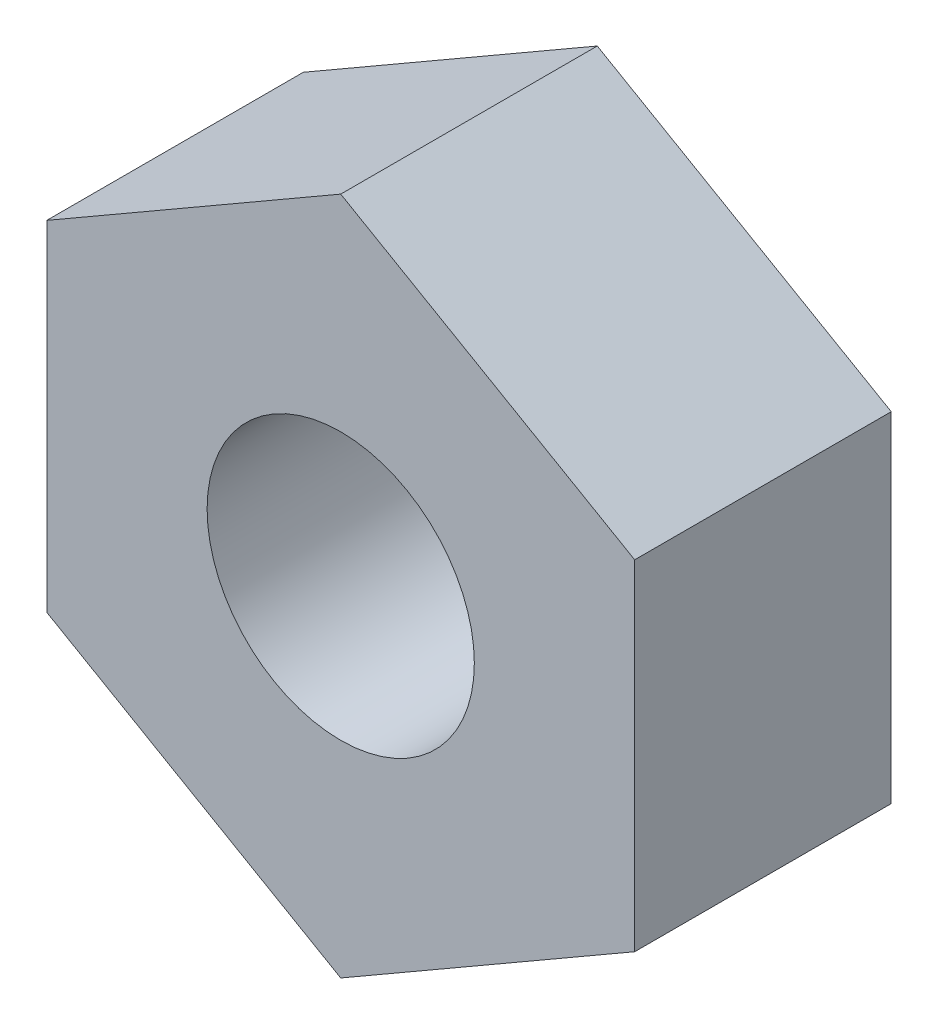
ISO-10303-21;
HEADER;
FILE_DESCRIPTION(('STEP AP214'),'2;1');
FILE_NAME('part.step','',(''),(''),'','','');
FILE_SCHEMA(('AUTOMOTIVE_DESIGN { 1 0 10303 214 1 1 1 1 }'));
ENDSEC;
DATA;
#1=APPLICATION_CONTEXT('core data for automotive mechanical design processes');
#2=APPLICATION_PROTOCOL_DEFINITION('international standard','automotive_design',2000,#1);
#3=PRODUCT_CONTEXT('',#1,'mechanical');
#4=PRODUCT('Part','Part','',(#3));
#5=PRODUCT_RELATED_PRODUCT_CATEGORY('part','',(#4));
#6=PRODUCT_DEFINITION_FORMATION('','',#4);
#7=PRODUCT_DEFINITION_CONTEXT('part definition',#1,'design');
#8=PRODUCT_DEFINITION('design','',#6,#7);
#9=PRODUCT_DEFINITION_SHAPE('','',#8);
#10=(LENGTH_UNIT() NAMED_UNIT(*) SI_UNIT(.MILLI.,.METRE.));
#11=(NAMED_UNIT(*) PLANE_ANGLE_UNIT() SI_UNIT($,.RADIAN.));
#12=(NAMED_UNIT(*) SI_UNIT($,.STERADIAN.) SOLID_ANGLE_UNIT());
#13=UNCERTAINTY_MEASURE_WITH_UNIT(LENGTH_MEASURE(1.E-05),#10,'distance_accuracy_value','');
#14=(GEOMETRIC_REPRESENTATION_CONTEXT(3) GLOBAL_UNCERTAINTY_ASSIGNED_CONTEXT((#13)) GLOBAL_UNIT_ASSIGNED_CONTEXT((#10,
#11,#12)) REPRESENTATION_CONTEXT('',''));
#15=CARTESIAN_POINT('',(0.,0.,0.));
#16=DIRECTION('',(0.,0.,1.));
#17=DIRECTION('',(1.,0.,0.));
#18=AXIS2_PLACEMENT_3D('',#15,#16,#17);
#19=CARTESIAN_POINT('',(0.,0.,2.4));
#20=DIRECTION('',(0.,0.,1.));
#21=DIRECTION('',(1.,0.,0.));
#22=AXIS2_PLACEMENT_3D('',#19,#20,#21);
#23=PLANE('',#22);
#24=DIRECTION('',(0.,1.,0.));
#25=VECTOR('',#24,1.);
#26=CARTESIAN_POINT('',(2.75,-1.58771324027147,2.4));
#27=LINE('',#26,#25);
#28=CARTESIAN_POINT('',(2.75,-1.58771324027147,2.4));
#29=VERTEX_POINT('',#28);
#30=CARTESIAN_POINT('',(2.75,1.58771324027147,2.4));
#31=VERTEX_POINT('',#30);
#32=EDGE_CURVE('E139',#29,#31,#27,.T.);
#33=ORIENTED_EDGE('',*,*,#32,.T.);
#34=DIRECTION('',(-0.866025403784439,0.5,0.));
#35=VECTOR('',#34,1.);
#36=CARTESIAN_POINT('',(2.75,1.58771324027147,2.4));
#37=LINE('',#36,#35);
#38=CARTESIAN_POINT('',(0.,3.17542648054294,2.4));
#39=VERTEX_POINT('',#38);
#40=EDGE_CURVE('E97',#31,#39,#37,.T.);
#41=ORIENTED_EDGE('',*,*,#40,.T.);
#42=DIRECTION('',(-0.866025403784439,-0.5,0.));
#43=VECTOR('',#42,1.);
#44=CARTESIAN_POINT('',(0.,3.17542648054294,2.4));
#45=LINE('',#44,#43);
#46=CARTESIAN_POINT('',(-2.75,1.58771324027147,2.4));
#47=VERTEX_POINT('',#46);
#48=EDGE_CURVE('E110',#39,#47,#45,.T.);
#49=ORIENTED_EDGE('',*,*,#48,.T.);
#50=DIRECTION('',(0.,-1.,0.));
#51=VECTOR('',#50,1.);
#52=CARTESIAN_POINT('',(-2.75,1.58771324027147,2.4));
#53=LINE('',#52,#51);
#54=CARTESIAN_POINT('',(-2.75,-1.58771324027147,2.4));
#55=VERTEX_POINT('',#54);
#56=EDGE_CURVE('E104',#47,#55,#53,.T.);
#57=ORIENTED_EDGE('',*,*,#56,.T.);
#58=DIRECTION('',(0.866025403784439,-0.5,0.));
#59=VECTOR('',#58,1.);
#60=CARTESIAN_POINT('',(-2.75,-1.58771324027147,2.4));
#61=LINE('',#60,#59);
#62=CARTESIAN_POINT('',(0.,-3.17542648054294,2.4));
#63=VERTEX_POINT('',#62);
#64=EDGE_CURVE('E108',#55,#63,#61,.T.);
#65=ORIENTED_EDGE('',*,*,#64,.T.);
#66=DIRECTION('',(0.866025403784439,0.5,0.));
#67=VECTOR('',#66,1.);
#68=CARTESIAN_POINT('',(0.,-3.17542648054294,2.4));
#69=LINE('',#68,#67);
#70=EDGE_CURVE('E60',#63,#29,#69,.T.);
#71=ORIENTED_EDGE('',*,*,#70,.T.);
#72=EDGE_LOOP('',(#33,#41,#49,#57,#65,#71));
#73=FACE_BOUND('',#72,.T.);
#74=CARTESIAN_POINT('',(0.,0.,2.4));
#75=DIRECTION('',(0.,0.,1.));
#76=DIRECTION('',(1.,0.,0.));
#77=AXIS2_PLACEMENT_3D('',#74,#75,#76);
#78=CIRCLE('',#77,1.25);
#79=CARTESIAN_POINT('',(1.25,0.,2.4));
#80=VERTEX_POINT('',#79);
#81=EDGE_CURVE('E132',#80,#80,#78,.T.);
#82=ORIENTED_EDGE('',*,*,#81,.F.);
#83=EDGE_LOOP('',(#82));
#84=FACE_BOUND('',#83,.T.);
#85=ADVANCED_FACE('F43',(#73,#84),#23,.T.);
#86=CARTESIAN_POINT('',(0.,0.,0.));
#87=DIRECTION('',(0.,0.,1.));
#88=DIRECTION('',(1.,0.,0.));
#89=AXIS2_PLACEMENT_3D('',#86,#87,#88);
#90=PLANE('',#89);
#91=DIRECTION('',(0.,1.,0.));
#92=VECTOR('',#91,1.);
#93=CARTESIAN_POINT('',(2.75,-1.58771324027147,0.));
#94=LINE('',#93,#92);
#95=CARTESIAN_POINT('',(2.75,-1.58771324027147,0.));
#96=VERTEX_POINT('',#95);
#97=CARTESIAN_POINT('',(2.75,1.58771324027147,0.));
#98=VERTEX_POINT('',#97);
#99=EDGE_CURVE('E128',#96,#98,#94,.T.);
#100=ORIENTED_EDGE('',*,*,#99,.F.);
#101=DIRECTION('',(0.866025403784439,0.5,0.));
#102=VECTOR('',#101,1.);
#103=CARTESIAN_POINT('',(0.,-3.17542648054294,0.));
#104=LINE('',#103,#102);
#105=CARTESIAN_POINT('',(0.,-3.17542648054294,0.));
#106=VERTEX_POINT('',#105);
#107=EDGE_CURVE('E89',#106,#96,#104,.T.);
#108=ORIENTED_EDGE('',*,*,#107,.F.);
#109=DIRECTION('',(0.866025403784439,-0.5,0.));
#110=VECTOR('',#109,1.);
#111=CARTESIAN_POINT('',(-2.75,-1.58771324027147,0.));
#112=LINE('',#111,#110);
#113=CARTESIAN_POINT('',(-2.75,-1.58771324027147,0.));
#114=VERTEX_POINT('',#113);
#115=EDGE_CURVE('E83',#114,#106,#112,.T.);
#116=ORIENTED_EDGE('',*,*,#115,.F.);
#117=DIRECTION('',(0.,-1.,0.));
#118=VECTOR('',#117,1.);
#119=CARTESIAN_POINT('',(-2.75,1.58771324027147,0.));
#120=LINE('',#119,#118);
#121=CARTESIAN_POINT('',(-2.75,1.58771324027147,0.));
#122=VERTEX_POINT('',#121);
#123=EDGE_CURVE('E118',#122,#114,#120,.T.);
#124=ORIENTED_EDGE('',*,*,#123,.F.);
#125=DIRECTION('',(-0.866025403784439,-0.5,0.));
#126=VECTOR('',#125,1.);
#127=CARTESIAN_POINT('',(0.,3.17542648054294,0.));
#128=LINE('',#127,#126);
#129=CARTESIAN_POINT('',(0.,3.17542648054294,0.));
#130=VERTEX_POINT('',#129);
#131=EDGE_CURVE('E134',#130,#122,#128,.T.);
#132=ORIENTED_EDGE('',*,*,#131,.F.);
#133=DIRECTION('',(-0.866025403784439,0.5,0.));
#134=VECTOR('',#133,1.);
#135=CARTESIAN_POINT('',(2.75,1.58771324027147,0.));
#136=LINE('',#135,#134);
#137=EDGE_CURVE('E131',#98,#130,#136,.T.);
#138=ORIENTED_EDGE('',*,*,#137,.F.);
#139=EDGE_LOOP('',(#100,#108,#116,#124,#132,#138));
#140=FACE_BOUND('',#139,.T.);
#141=CARTESIAN_POINT('',(0.,0.,0.));
#142=DIRECTION('',(0.,0.,1.));
#143=DIRECTION('',(1.,0.,0.));
#144=AXIS2_PLACEMENT_3D('',#141,#142,#143);
#145=CIRCLE('',#144,1.25);
#146=CARTESIAN_POINT('',(1.25,0.,0.));
#147=VERTEX_POINT('',#146);
#148=EDGE_CURVE('E232',#147,#147,#145,.T.);
#149=ORIENTED_EDGE('',*,*,#148,.T.);
#150=EDGE_LOOP('',(#149));
#151=FACE_BOUND('',#150,.T.);
#152=ADVANCED_FACE('F148',(#140,#151),#90,.F.);
#153=CARTESIAN_POINT('',(2.75,-1.58771324027147,2.4));
#154=DIRECTION('',(-1.,0.,0.));
#155=DIRECTION('',(0.,-1.,0.));
#156=AXIS2_PLACEMENT_3D('',#153,#154,#155);
#157=PLANE('',#156);
#158=ORIENTED_EDGE('',*,*,#99,.T.);
#159=DIRECTION('',(0.,0.,-1.));
#160=VECTOR('',#159,1.);
#161=CARTESIAN_POINT('',(2.75,1.58771324027147,2.4));
#162=LINE('',#161,#160);
#163=EDGE_CURVE('E11',#31,#98,#162,.T.);
#164=ORIENTED_EDGE('',*,*,#163,.F.);
#165=ORIENTED_EDGE('',*,*,#32,.F.);
#166=DIRECTION('',(0.,0.,-1.));
#167=VECTOR('',#166,1.);
#168=CARTESIAN_POINT('',(2.75,-1.58771324027147,2.4));
#169=LINE('',#168,#167);
#170=EDGE_CURVE('E124',#29,#96,#169,.T.);
#171=ORIENTED_EDGE('',*,*,#170,.T.);
#172=EDGE_LOOP('',(#158,#164,#165,#171));
#173=FACE_BOUND('',#172,.T.);
#174=ADVANCED_FACE('F45',(#173),#157,.F.);
#175=CARTESIAN_POINT('',(2.75,1.58771324027147,2.4));
#176=DIRECTION('',(-0.5,-0.866025403784439,0.));
#177=DIRECTION('',(0.866025403784439,-0.5,0.));
#178=AXIS2_PLACEMENT_3D('',#175,#176,#177);
#179=PLANE('',#178);
#180=ORIENTED_EDGE('',*,*,#137,.T.);
#181=DIRECTION('',(0.,0.,-1.));
#182=VECTOR('',#181,1.);
#183=CARTESIAN_POINT('',(0.,3.17542648054294,2.4));
#184=LINE('',#183,#182);
#185=EDGE_CURVE('E52',#39,#130,#184,.T.);
#186=ORIENTED_EDGE('',*,*,#185,.F.);
#187=ORIENTED_EDGE('',*,*,#40,.F.);
#188=ORIENTED_EDGE('',*,*,#163,.T.);
#189=EDGE_LOOP('',(#180,#186,#187,#188));
#190=FACE_BOUND('',#189,.T.);
#191=ADVANCED_FACE('F173',(#190),#179,.F.);
#192=CARTESIAN_POINT('',(0.,3.17542648054294,2.4));
#193=DIRECTION('',(0.5,-0.866025403784439,0.));
#194=DIRECTION('',(0.866025403784439,0.5,0.));
#195=AXIS2_PLACEMENT_3D('',#192,#193,#194);
#196=PLANE('',#195);
#197=ORIENTED_EDGE('',*,*,#131,.T.);
#198=DIRECTION('',(0.,0.,-1.));
#199=VECTOR('',#198,1.);
#200=CARTESIAN_POINT('',(-2.75,1.58771324027147,2.4));
#201=LINE('',#200,#199);
#202=EDGE_CURVE('E119',#47,#122,#201,.T.);
#203=ORIENTED_EDGE('',*,*,#202,.F.);
#204=ORIENTED_EDGE('',*,*,#48,.F.);
#205=ORIENTED_EDGE('',*,*,#185,.T.);
#206=EDGE_LOOP('',(#197,#203,#204,#205));
#207=FACE_BOUND('',#206,.T.);
#208=ADVANCED_FACE('F145',(#207),#196,.F.);
#209=CARTESIAN_POINT('',(-2.75,1.58771324027147,2.4));
#210=DIRECTION('',(1.,0.,0.));
#211=DIRECTION('',(0.,1.,0.));
#212=AXIS2_PLACEMENT_3D('',#209,#210,#211);
#213=PLANE('',#212);
#214=ORIENTED_EDGE('',*,*,#123,.T.);
#215=DIRECTION('',(0.,0.,-1.));
#216=VECTOR('',#215,1.);
#217=CARTESIAN_POINT('',(-2.75,-1.58771324027147,2.4));
#218=LINE('',#217,#216);
#219=EDGE_CURVE('E115',#55,#114,#218,.T.);
#220=ORIENTED_EDGE('',*,*,#219,.F.);
#221=ORIENTED_EDGE('',*,*,#56,.F.);
#222=ORIENTED_EDGE('',*,*,#202,.T.);
#223=EDGE_LOOP('',(#214,#220,#221,#222));
#224=FACE_BOUND('',#223,.T.);
#225=ADVANCED_FACE('F116',(#224),#213,.F.);
#226=CARTESIAN_POINT('',(-2.75,-1.58771324027147,2.4));
#227=DIRECTION('',(0.5,0.866025403784439,0.));
#228=DIRECTION('',(-0.866025403784439,0.5,0.));
#229=AXIS2_PLACEMENT_3D('',#226,#227,#228);
#230=PLANE('',#229);
#231=ORIENTED_EDGE('',*,*,#115,.T.);
#232=DIRECTION('',(0.,0.,-1.));
#233=VECTOR('',#232,1.);
#234=CARTESIAN_POINT('',(0.,-3.17542648054294,2.4));
#235=LINE('',#234,#233);
#236=EDGE_CURVE('E120',#63,#106,#235,.T.);
#237=ORIENTED_EDGE('',*,*,#236,.F.);
#238=ORIENTED_EDGE('',*,*,#64,.F.);
#239=ORIENTED_EDGE('',*,*,#219,.T.);
#240=EDGE_LOOP('',(#231,#237,#238,#239));
#241=FACE_BOUND('',#240,.T.);
#242=ADVANCED_FACE('F122',(#241),#230,.F.);
#243=CARTESIAN_POINT('',(0.,-3.17542648054294,2.4));
#244=DIRECTION('',(-0.5,0.866025403784439,0.));
#245=DIRECTION('',(-0.866025403784439,-0.5,0.));
#246=AXIS2_PLACEMENT_3D('',#243,#244,#245);
#247=PLANE('',#246);
#248=ORIENTED_EDGE('',*,*,#107,.T.);
#249=ORIENTED_EDGE('',*,*,#170,.F.);
#250=ORIENTED_EDGE('',*,*,#70,.F.);
#251=ORIENTED_EDGE('',*,*,#236,.T.);
#252=EDGE_LOOP('',(#248,#249,#250,#251));
#253=FACE_BOUND('',#252,.T.);
#254=ADVANCED_FACE('F153',(#253),#247,.F.);
#255=CARTESIAN_POINT('',(0.,0.,2.4));
#256=DIRECTION('',(0.,0.,-1.));
#257=DIRECTION('',(-1.,0.,0.));
#258=AXIS2_PLACEMENT_3D('',#255,#256,#257);
#259=CYLINDRICAL_SURFACE('',#258,1.25);
#260=ORIENTED_EDGE('',*,*,#81,.T.);
#261=EDGE_LOOP('',(#260));
#262=FACE_BOUND('',#261,.T.);
#263=ORIENTED_EDGE('',*,*,#148,.F.);
#264=EDGE_LOOP('',(#263));
#265=FACE_BOUND('',#264,.T.);
#266=ADVANCED_FACE('F155',(#262,#265),#259,.F.);
#267=CLOSED_SHELL('',(#85,#152,#174,#191,#208,#225,#242,#254,#266));
#268=MANIFOLD_SOLID_BREP('B2',#267);
#269=ADVANCED_BREP_SHAPE_REPRESENTATION('',(#18,#268),#14);
#270=SHAPE_DEFINITION_REPRESENTATION(#9,#269);
ENDSEC;
END-ISO-10303-21;
